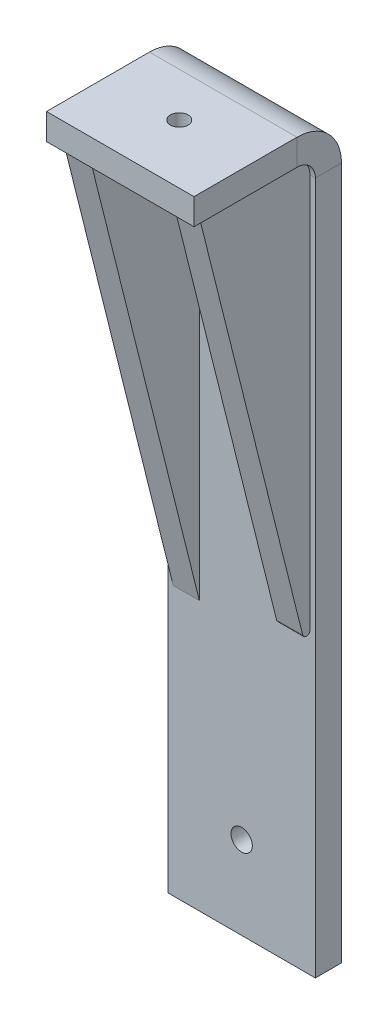
ISO-10303-21;
HEADER;
FILE_DESCRIPTION(('STEP AP214'),'2;1');
FILE_NAME('part.step','',(''),(''),'','','');
FILE_SCHEMA(('AUTOMOTIVE_DESIGN { 1 0 10303 214 1 1 1 1 }'));
ENDSEC;
DATA;
#1=APPLICATION_CONTEXT('core data for automotive mechanical design processes');
#2=APPLICATION_PROTOCOL_DEFINITION('international standard','automotive_design',2000,#1);
#3=PRODUCT_CONTEXT('',#1,'mechanical');
#4=PRODUCT('Part','Part','',(#3));
#5=PRODUCT_RELATED_PRODUCT_CATEGORY('part','',(#4));
#6=PRODUCT_DEFINITION_FORMATION('','',#4);
#7=PRODUCT_DEFINITION_CONTEXT('part definition',#1,'design');
#8=PRODUCT_DEFINITION('design','',#6,#7);
#9=PRODUCT_DEFINITION_SHAPE('','',#8);
#10=(LENGTH_UNIT() NAMED_UNIT(*) SI_UNIT(.MILLI.,.METRE.));
#11=(NAMED_UNIT(*) PLANE_ANGLE_UNIT() SI_UNIT($,.RADIAN.));
#12=(NAMED_UNIT(*) SI_UNIT($,.STERADIAN.) SOLID_ANGLE_UNIT());
#13=UNCERTAINTY_MEASURE_WITH_UNIT(LENGTH_MEASURE(1.E-05),#10,'distance_accuracy_value','');
#14=(GEOMETRIC_REPRESENTATION_CONTEXT(3) GLOBAL_UNCERTAINTY_ASSIGNED_CONTEXT((#13)) GLOBAL_UNIT_ASSIGNED_CONTEXT((#10,
#11,#12)) REPRESENTATION_CONTEXT('',''));
#15=CARTESIAN_POINT('',(0.,0.,0.));
#16=DIRECTION('',(0.,0.,1.));
#17=DIRECTION('',(1.,0.,0.));
#18=AXIS2_PLACEMENT_3D('',#15,#16,#17);
#19=CARTESIAN_POINT('',(-11.7729,122.5042,23.5458));
#20=DIRECTION('',(0.,-1.,0.));
#21=DIRECTION('',(0.,0.,-1.));
#22=AXIS2_PLACEMENT_3D('',#19,#20,#21);
#23=PLANE('',#22);
#24=DIRECTION('',(0.,0.,1.));
#25=VECTOR('',#24,1.);
#26=CARTESIAN_POINT('',(-7.2771,122.5042,23.5458));
#27=LINE('',#26,#25);
#28=CARTESIAN_POINT('',(-7.2771,122.5042,7.67079999999999));
#29=VERTEX_POINT('',#28);
#30=CARTESIAN_POINT('',(-7.2771,122.5042,23.5458));
#31=VERTEX_POINT('',#30);
#32=EDGE_CURVE('E133',#29,#31,#27,.T.);
#33=ORIENTED_EDGE('',*,*,#32,.F.);
#34=DIRECTION('',(1.,0.,0.));
#35=VECTOR('',#34,1.);
#36=CARTESIAN_POINT('',(-11.7729,122.5042,7.67079999999999));
#37=LINE('',#36,#35);
#38=CARTESIAN_POINT('',(-11.7729,122.5042,7.67079999999999));
#39=VERTEX_POINT('',#38);
#40=EDGE_CURVE('E132',#39,#29,#37,.T.);
#41=ORIENTED_EDGE('',*,*,#40,.F.);
#42=DIRECTION('',(0.,0.,1.));
#43=VECTOR('',#42,1.);
#44=CARTESIAN_POINT('',(-11.7729,122.5042,23.5458));
#45=LINE('',#44,#43);
#46=CARTESIAN_POINT('',(-11.7729,122.5042,23.5458));
#47=VERTEX_POINT('',#46);
#48=EDGE_CURVE('E127',#39,#47,#45,.T.);
#49=ORIENTED_EDGE('',*,*,#48,.T.);
#50=DIRECTION('',(1.,0.,0.));
#51=VECTOR('',#50,1.);
#52=CARTESIAN_POINT('',(-11.7729,122.5042,23.5458));
#53=LINE('',#52,#51);
#54=EDGE_CURVE('E14',#47,#31,#53,.T.);
#55=ORIENTED_EDGE('',*,*,#54,.T.);
#56=EDGE_LOOP('',(#33,#41,#49,#55));
#57=FACE_BOUND('',#56,.T.);
#58=ADVANCED_FACE('F70',(#57),#23,.F.);
#59=CARTESIAN_POINT('',(-11.7729,122.5042,23.5458));
#60=DIRECTION('',(0.,0.242535625036333,-0.970142500145332));
#61=DIRECTION('',(0.,0.970142500145332,0.242535625036333));
#62=AXIS2_PLACEMENT_3D('',#59,#60,#61);
#63=PLANE('',#62);
#64=DIRECTION('',(0.,-0.970142500145332,-0.242535625036333));
#65=VECTOR('',#64,1.);
#66=CARTESIAN_POINT('',(-7.2771,122.5042,23.5458));
#67=LINE('',#66,#65);
#68=CARTESIAN_POINT('',(-7.2771,46.3042,4.4958));
#69=VERTEX_POINT('',#68);
#70=EDGE_CURVE('E135',#31,#69,#67,.T.);
#71=ORIENTED_EDGE('',*,*,#70,.F.);
#72=ORIENTED_EDGE('',*,*,#54,.F.);
#73=DIRECTION('',(0.,-0.970142500145332,-0.242535625036333));
#74=VECTOR('',#73,1.);
#75=CARTESIAN_POINT('',(-11.7729,122.5042,23.5458));
#76=LINE('',#75,#74);
#77=CARTESIAN_POINT('',(-11.7729,46.3042,4.4958));
#78=VERTEX_POINT('',#77);
#79=EDGE_CURVE('E111',#47,#78,#76,.T.);
#80=ORIENTED_EDGE('',*,*,#79,.T.);
#81=DIRECTION('',(1.,0.,0.));
#82=VECTOR('',#81,1.);
#83=CARTESIAN_POINT('',(-11.7729,46.3042,4.4958));
#84=LINE('',#83,#82);
#85=EDGE_CURVE('E78',#78,#69,#84,.T.);
#86=ORIENTED_EDGE('',*,*,#85,.T.);
#87=EDGE_LOOP('',(#71,#72,#80,#86));
#88=FACE_BOUND('',#87,.T.);
#89=ADVANCED_FACE('F125',(#88),#63,.F.);
#90=CARTESIAN_POINT('',(-11.7729,119.3292,4.49580000000001));
#91=DIRECTION('',(0.,0.,1.));
#92=DIRECTION('',(0.,-1.,0.));
#93=AXIS2_PLACEMENT_3D('',#90,#91,#92);
#94=PLANE('',#93);
#95=DIRECTION('',(0.,1.,0.));
#96=VECTOR('',#95,1.);
#97=CARTESIAN_POINT('',(-7.2771,119.3292,4.49580000000001));
#98=LINE('',#97,#96);
#99=CARTESIAN_POINT('',(-7.2771,119.3292,4.49580000000001));
#100=VERTEX_POINT('',#99);
#101=EDGE_CURVE('E121',#69,#100,#98,.T.);
#102=ORIENTED_EDGE('',*,*,#101,.F.);
#103=ORIENTED_EDGE('',*,*,#85,.F.);
#104=DIRECTION('',(0.,1.,0.));
#105=VECTOR('',#104,1.);
#106=CARTESIAN_POINT('',(-11.7729,119.3292,4.49580000000001));
#107=LINE('',#106,#105);
#108=CARTESIAN_POINT('',(-11.7729,119.3292,4.49580000000001));
#109=VERTEX_POINT('',#108);
#110=EDGE_CURVE('E114',#78,#109,#107,.T.);
#111=ORIENTED_EDGE('',*,*,#110,.T.);
#112=DIRECTION('',(1.,0.,0.));
#113=VECTOR('',#112,1.);
#114=CARTESIAN_POINT('',(-11.7729,119.3292,4.49580000000001));
#115=LINE('',#114,#113);
#116=EDGE_CURVE('E124',#109,#100,#115,.T.);
#117=ORIENTED_EDGE('',*,*,#116,.T.);
#118=EDGE_LOOP('',(#102,#103,#111,#117));
#119=FACE_BOUND('',#118,.T.);
#120=ADVANCED_FACE('F120',(#119),#94,.F.);
#121=CARTESIAN_POINT('',(-11.7729,119.3292,7.6708));
#122=DIRECTION('',(1.,0.,0.));
#123=DIRECTION('',(0.,0.,1.));
#124=AXIS2_PLACEMENT_3D('',#121,#122,#123);
#125=CYLINDRICAL_SURFACE('',#124,3.175);
#126=CARTESIAN_POINT('',(-7.2771,119.3292,7.6708));
#127=DIRECTION('',(1.,0.,0.));
#128=DIRECTION('',(0.,0.,-1.));
#129=AXIS2_PLACEMENT_3D('',#126,#127,#128);
#130=CIRCLE('',#129,3.175);
#131=EDGE_CURVE('E100',#100,#29,#130,.T.);
#132=ORIENTED_EDGE('',*,*,#131,.F.);
#133=ORIENTED_EDGE('',*,*,#116,.F.);
#134=CARTESIAN_POINT('',(-11.7729,119.3292,7.6708));
#135=DIRECTION('',(1.,0.,0.));
#136=DIRECTION('',(0.,0.,-1.));
#137=AXIS2_PLACEMENT_3D('',#134,#135,#136);
#138=CIRCLE('',#137,3.175);
#139=EDGE_CURVE('E86',#109,#39,#138,.T.);
#140=ORIENTED_EDGE('',*,*,#139,.T.);
#141=ORIENTED_EDGE('',*,*,#40,.T.);
#142=EDGE_LOOP('',(#132,#133,#140,#141));
#143=FACE_BOUND('',#142,.T.);
#144=ADVANCED_FACE('F144',(#143),#125,.T.);
#145=CARTESIAN_POINT('',(-11.7729,119.3292,7.6708));
#146=DIRECTION('',(-1.,0.,0.));
#147=DIRECTION('',(0.,0.,-1.));
#148=AXIS2_PLACEMENT_3D('',#145,#146,#147);
#149=PLANE('',#148);
#150=ORIENTED_EDGE('',*,*,#48,.F.);
#151=ORIENTED_EDGE('',*,*,#139,.F.);
#152=ORIENTED_EDGE('',*,*,#110,.F.);
#153=ORIENTED_EDGE('',*,*,#79,.F.);
#154=EDGE_LOOP('',(#150,#151,#152,#153));
#155=FACE_BOUND('',#154,.T.);
#156=ADVANCED_FACE('F116',(#155),#149,.T.);
#157=CARTESIAN_POINT('',(-7.2771,119.3292,7.6708));
#158=DIRECTION('',(-1.,0.,0.));
#159=DIRECTION('',(0.,0.,-1.));
#160=AXIS2_PLACEMENT_3D('',#157,#158,#159);
#161=PLANE('',#160);
#162=ORIENTED_EDGE('',*,*,#32,.T.);
#163=ORIENTED_EDGE('',*,*,#70,.T.);
#164=ORIENTED_EDGE('',*,*,#101,.T.);
#165=ORIENTED_EDGE('',*,*,#131,.T.);
#166=EDGE_LOOP('',(#162,#163,#164,#165));
#167=FACE_BOUND('',#166,.T.);
#168=ADVANCED_FACE('F140',(#167),#161,.F.);
#169=CLOSED_SHELL('',(#58,#89,#120,#144,#156,#168));
#170=MANIFOLD_SOLID_BREP('B2',#169);
#171=CARTESIAN_POINT('',(11.7729,122.5042,23.5458));
#172=DIRECTION('',(0.,-1.,0.));
#173=DIRECTION('',(0.,0.,-1.));
#174=AXIS2_PLACEMENT_3D('',#171,#172,#173);
#175=PLANE('',#174);
#176=DIRECTION('',(0.,0.,1.));
#177=VECTOR('',#176,1.);
#178=CARTESIAN_POINT('',(7.2771,122.5042,23.5458));
#179=LINE('',#178,#177);
#180=CARTESIAN_POINT('',(7.2771,122.5042,7.67079999999999));
#181=VERTEX_POINT('',#180);
#182=CARTESIAN_POINT('',(7.2771,122.5042,22.7325069819332));
#183=VERTEX_POINT('',#182);
#184=EDGE_CURVE('E282',#181,#183,#179,.T.);
#185=ORIENTED_EDGE('',*,*,#184,.T.);
#186=DIRECTION('',(-1.,0.,0.));
#187=VECTOR('',#186,1.);
#188=CARTESIAN_POINT('',(11.7729,122.5042,22.7325069819332));
#189=LINE('',#188,#187);
#190=CARTESIAN_POINT('',(11.7729,122.5042,22.7325069819332));
#191=VERTEX_POINT('',#190);
#192=EDGE_CURVE('E226',#183,#191,#189,.F.);
#193=ORIENTED_EDGE('',*,*,#192,.T.);
#194=DIRECTION('',(0.,0.,1.));
#195=VECTOR('',#194,1.);
#196=CARTESIAN_POINT('',(11.7729,122.5042,23.5458));
#197=LINE('',#196,#195);
#198=CARTESIAN_POINT('',(11.7729,122.5042,7.67079999999999));
#199=VERTEX_POINT('',#198);
#200=EDGE_CURVE('E289',#199,#191,#197,.T.);
#201=ORIENTED_EDGE('',*,*,#200,.F.);
#202=DIRECTION('',(-1.,0.,0.));
#203=VECTOR('',#202,1.);
#204=CARTESIAN_POINT('',(11.7729,122.5042,7.67079999999999));
#205=LINE('',#204,#203);
#206=EDGE_CURVE('E274',#199,#181,#205,.T.);
#207=ORIENTED_EDGE('',*,*,#206,.T.);
#208=EDGE_LOOP('',(#185,#193,#201,#207));
#209=FACE_BOUND('',#208,.T.);
#210=ADVANCED_FACE('F203',(#209),#175,.F.);
#211=CARTESIAN_POINT('',(11.7729,122.5042,23.5458));
#212=DIRECTION('',(0.,0.242535625036333,-0.970142500145332));
#213=DIRECTION('',(0.,0.970142500145332,0.242535625036333));
#214=AXIS2_PLACEMENT_3D('',#211,#212,#213);
#215=PLANE('',#214);
#216=DIRECTION('',(0.,-0.970142500145332,-0.242535625036333));
#217=VECTOR('',#216,1.);
#218=CARTESIAN_POINT('',(11.7729,122.5042,23.5458));
#219=LINE('',#218,#217);
#220=CARTESIAN_POINT('',(11.7729,121.715189878102,23.3485474695255));
#221=VERTEX_POINT('',#220);
#222=CARTESIAN_POINT('',(11.7729,51.3083619503691,5.74684048759229));
#223=VERTEX_POINT('',#222);
#224=EDGE_CURVE('E264',#221,#223,#219,.T.);
#225=ORIENTED_EDGE('',*,*,#224,.F.);
#226=DIRECTION('',(-1.,0.,0.));
#227=VECTOR('',#226,1.);
#228=CARTESIAN_POINT('',(11.7729,121.715189878102,23.3485474695255));
#229=LINE('',#228,#227);
#230=CARTESIAN_POINT('',(7.2771,121.715189878102,23.3485474695255));
#231=VERTEX_POINT('',#230);
#232=EDGE_CURVE('E292',#221,#231,#229,.T.);
#233=ORIENTED_EDGE('',*,*,#232,.T.);
#234=DIRECTION('',(0.,-0.970142500145332,-0.242535625036333));
#235=VECTOR('',#234,1.);
#236=CARTESIAN_POINT('',(7.2771,122.5042,23.5458));
#237=LINE('',#236,#235);
#238=CARTESIAN_POINT('',(7.2771,51.3083619503691,5.74684048759229));
#239=VERTEX_POINT('',#238);
#240=EDGE_CURVE('E284',#231,#239,#237,.T.);
#241=ORIENTED_EDGE('',*,*,#240,.T.);
#242=DIRECTION('',(-1.,0.,0.));
#243=VECTOR('',#242,1.);
#244=CARTESIAN_POINT('',(11.7729,51.3083619503691,5.74684048759229));
#245=LINE('',#244,#243);
#246=EDGE_CURVE('E273',#239,#223,#245,.F.);
#247=ORIENTED_EDGE('',*,*,#246,.T.);
#248=EDGE_LOOP('',(#225,#233,#241,#247));
#249=FACE_BOUND('',#248,.T.);
#250=ADVANCED_FACE('F305',(#249),#215,.F.);
#251=CARTESIAN_POINT('',(11.7729,119.3292,4.49580000000001));
#252=DIRECTION('',(0.,0.,1.));
#253=DIRECTION('',(0.,-1.,0.));
#254=AXIS2_PLACEMENT_3D('',#251,#252,#253);
#255=PLANE('',#254);
#256=DIRECTION('',(0.,1.,0.));
#257=VECTOR('',#256,1.);
#258=CARTESIAN_POINT('',(11.7729,119.3292,4.49580000000001));
#259=LINE('',#258,#257);
#260=CARTESIAN_POINT('',(11.7729,51.4623720722672,4.4958));
#261=VERTEX_POINT('',#260);
#262=CARTESIAN_POINT('',(11.7729,119.3292,4.49580000000001));
#263=VERTEX_POINT('',#262);
#264=EDGE_CURVE('E256',#261,#263,#259,.T.);
#265=ORIENTED_EDGE('',*,*,#264,.F.);
#266=DIRECTION('',(-1.,0.,0.));
#267=VECTOR('',#266,1.);
#268=CARTESIAN_POINT('',(11.7729,51.4623720722672,4.4958));
#269=LINE('',#268,#267);
#270=CARTESIAN_POINT('',(7.2771,51.4623720722672,4.4958));
#271=VERTEX_POINT('',#270);
#272=EDGE_CURVE('E68',#261,#271,#269,.T.);
#273=ORIENTED_EDGE('',*,*,#272,.T.);
#274=DIRECTION('',(0.,1.,0.));
#275=VECTOR('',#274,1.);
#276=CARTESIAN_POINT('',(7.2771,119.3292,4.49580000000001));
#277=LINE('',#276,#275);
#278=CARTESIAN_POINT('',(7.2771,119.3292,4.49580000000001));
#279=VERTEX_POINT('',#278);
#280=EDGE_CURVE('E270',#271,#279,#277,.T.);
#281=ORIENTED_EDGE('',*,*,#280,.T.);
#282=DIRECTION('',(-1.,0.,0.));
#283=VECTOR('',#282,1.);
#284=CARTESIAN_POINT('',(11.7729,119.3292,4.49580000000001));
#285=LINE('',#284,#283);
#286=EDGE_CURVE('E267',#263,#279,#285,.T.);
#287=ORIENTED_EDGE('',*,*,#286,.F.);
#288=EDGE_LOOP('',(#265,#273,#281,#287));
#289=FACE_BOUND('',#288,.T.);
#290=ADVANCED_FACE('F268',(#289),#255,.F.);
#291=CARTESIAN_POINT('',(11.7729,119.3292,7.6708));
#292=DIRECTION('',(-1.,0.,0.));
#293=DIRECTION('',(0.,0.,1.));
#294=AXIS2_PLACEMENT_3D('',#291,#292,#293);
#295=CYLINDRICAL_SURFACE('',#294,3.175);
#296=CARTESIAN_POINT('',(7.2771,119.3292,7.6708));
#297=DIRECTION('',(1.,0.,0.));
#298=DIRECTION('',(0.,0.,-1.));
#299=AXIS2_PLACEMENT_3D('',#296,#297,#298);
#300=CIRCLE('',#299,3.175);
#301=EDGE_CURVE('E288',#279,#181,#300,.T.);
#302=ORIENTED_EDGE('',*,*,#301,.T.);
#303=ORIENTED_EDGE('',*,*,#206,.F.);
#304=CARTESIAN_POINT('',(11.7729,119.3292,7.6708));
#305=DIRECTION('',(1.,0.,0.));
#306=DIRECTION('',(0.,0.,-1.));
#307=AXIS2_PLACEMENT_3D('',#304,#305,#306);
#308=CIRCLE('',#307,3.175);
#309=EDGE_CURVE('E260',#263,#199,#308,.T.);
#310=ORIENTED_EDGE('',*,*,#309,.F.);
#311=ORIENTED_EDGE('',*,*,#286,.T.);
#312=EDGE_LOOP('',(#302,#303,#310,#311));
#313=FACE_BOUND('',#312,.T.);
#314=ADVANCED_FACE('F276',(#313),#295,.T.);
#315=CARTESIAN_POINT('',(11.7729,119.3292,7.6708));
#316=DIRECTION('',(1.,0.,0.));
#317=DIRECTION('',(0.,0.,-1.));
#318=AXIS2_PLACEMENT_3D('',#315,#316,#317);
#319=PLANE('',#318);
#320=ORIENTED_EDGE('',*,*,#200,.T.);
#321=CARTESIAN_POINT('',(11.7729,121.8692,22.7325069819332));
#322=DIRECTION('',(1.,0.,0.));
#323=DIRECTION('',(0.,0.,-1.));
#324=AXIS2_PLACEMENT_3D('',#321,#322,#323);
#325=CIRCLE('',#324,0.635);
#326=EDGE_CURVE('E211',#191,#221,#325,.T.);
#327=ORIENTED_EDGE('',*,*,#326,.T.);
#328=ORIENTED_EDGE('',*,*,#224,.T.);
#329=CARTESIAN_POINT('',(11.7729,51.4623720722672,5.1308));
#330=DIRECTION('',(1.,0.,0.));
#331=DIRECTION('',(0.,0.,-1.));
#332=AXIS2_PLACEMENT_3D('',#329,#330,#331);
#333=CIRCLE('',#332,0.635);
#334=EDGE_CURVE('E218',#223,#261,#333,.T.);
#335=ORIENTED_EDGE('',*,*,#334,.T.);
#336=ORIENTED_EDGE('',*,*,#264,.T.);
#337=ORIENTED_EDGE('',*,*,#309,.T.);
#338=EDGE_LOOP('',(#320,#327,#328,#335,#336,#337));
#339=FACE_BOUND('',#338,.T.);
#340=ADVANCED_FACE('F258',(#339),#319,.T.);
#341=CARTESIAN_POINT('',(7.2771,119.3292,7.6708));
#342=DIRECTION('',(1.,0.,0.));
#343=DIRECTION('',(0.,0.,-1.));
#344=AXIS2_PLACEMENT_3D('',#341,#342,#343);
#345=PLANE('',#344);
#346=ORIENTED_EDGE('',*,*,#240,.F.);
#347=CARTESIAN_POINT('',(7.2771,121.8692,22.7325069819332));
#348=DIRECTION('',(1.,0.,0.));
#349=DIRECTION('',(0.,0.,-1.));
#350=AXIS2_PLACEMENT_3D('',#347,#348,#349);
#351=CIRCLE('',#350,0.635);
#352=EDGE_CURVE('E297',#231,#183,#351,.F.);
#353=ORIENTED_EDGE('',*,*,#352,.T.);
#354=ORIENTED_EDGE('',*,*,#184,.F.);
#355=ORIENTED_EDGE('',*,*,#301,.F.);
#356=ORIENTED_EDGE('',*,*,#280,.F.);
#357=CARTESIAN_POINT('',(7.2771,51.4623720722672,5.1308));
#358=DIRECTION('',(1.,0.,0.));
#359=DIRECTION('',(0.,0.,-1.));
#360=AXIS2_PLACEMENT_3D('',#357,#358,#359);
#361=CIRCLE('',#360,0.635);
#362=EDGE_CURVE('E295',#271,#239,#361,.F.);
#363=ORIENTED_EDGE('',*,*,#362,.T.);
#364=EDGE_LOOP('',(#346,#353,#354,#355,#356,#363));
#365=FACE_BOUND('',#364,.T.);
#366=ADVANCED_FACE('F311',(#365),#345,.F.);
#367=CARTESIAN_POINT('',(11.7729,121.8692,22.7325069819332));
#368=DIRECTION('',(-1.,0.,0.));
#369=DIRECTION('',(0.,0.,1.));
#370=AXIS2_PLACEMENT_3D('',#367,#368,#369);
#371=CYLINDRICAL_SURFACE('',#370,0.635);
#372=ORIENTED_EDGE('',*,*,#326,.F.);
#373=ORIENTED_EDGE('',*,*,#192,.F.);
#374=ORIENTED_EDGE('',*,*,#352,.F.);
#375=ORIENTED_EDGE('',*,*,#232,.F.);
#376=EDGE_LOOP('',(#372,#373,#374,#375));
#377=FACE_BOUND('',#376,.T.);
#378=ADVANCED_FACE('F308',(#377),#371,.T.);
#379=CARTESIAN_POINT('',(11.7729,51.4623720722672,5.1308));
#380=DIRECTION('',(-1.,0.,0.));
#381=DIRECTION('',(0.,0.,1.));
#382=AXIS2_PLACEMENT_3D('',#379,#380,#381);
#383=CYLINDRICAL_SURFACE('',#382,0.635);
#384=ORIENTED_EDGE('',*,*,#334,.F.);
#385=ORIENTED_EDGE('',*,*,#246,.F.);
#386=ORIENTED_EDGE('',*,*,#362,.F.);
#387=ORIENTED_EDGE('',*,*,#272,.F.);
#388=EDGE_LOOP('',(#384,#385,#386,#387));
#389=FACE_BOUND('',#388,.T.);
#390=ADVANCED_FACE('F205',(#389),#383,.T.);
#391=CLOSED_SHELL('',(#210,#250,#290,#314,#340,#366,#378,#390));
#392=MANIFOLD_SOLID_BREP('B8',#391);
#393=CARTESIAN_POINT('',(-12.7,127.,4.4958));
#394=DIRECTION('',(0.,0.,-1.));
#395=DIRECTION('',(-1.,0.,0.));
#396=AXIS2_PLACEMENT_3D('',#393,#394,#395);
#397=PLANE('',#396);
#398=CARTESIAN_POINT('',(0.,14.280866767059,4.4958));
#399=DIRECTION('',(0.,0.,1.));
#400=DIRECTION('',(1.,0.,0.));
#401=AXIS2_PLACEMENT_3D('',#398,#399,#400);
#402=CIRCLE('',#401,1.8415);
#403=CARTESIAN_POINT('',(1.8415,14.280866767059,4.4958));
#404=VERTEX_POINT('',#403);
#405=EDGE_CURVE('E550',#404,#404,#402,.T.);
#406=ORIENTED_EDGE('',*,*,#405,.F.);
#407=EDGE_LOOP('',(#406));
#408=FACE_BOUND('',#407,.T.);
#409=DIRECTION('',(-1.,0.,0.));
#410=VECTOR('',#409,1.);
#411=CARTESIAN_POINT('',(-12.7,119.3292,4.49580000000001));
#412=LINE('',#411,#410);
#413=CARTESIAN_POINT('',(-12.7,119.3292,4.49580000000001));
#414=VERTEX_POINT('',#413);
#415=CARTESIAN_POINT('',(12.7,119.3292,4.49580000000001));
#416=VERTEX_POINT('',#415);
#417=EDGE_CURVE('E501',#414,#416,#412,.F.);
#418=ORIENTED_EDGE('',*,*,#417,.F.);
#419=DIRECTION('',(0.,-1.,0.));
#420=VECTOR('',#419,1.);
#421=CARTESIAN_POINT('',(-12.7,127.,4.4958));
#422=LINE('',#421,#420);
#423=CARTESIAN_POINT('',(-12.7,0.,4.4958));
#424=VERTEX_POINT('',#423);
#425=EDGE_CURVE('E392',#414,#424,#422,.T.);
#426=ORIENTED_EDGE('',*,*,#425,.T.);
#427=DIRECTION('',(1.,0.,0.));
#428=VECTOR('',#427,1.);
#429=CARTESIAN_POINT('',(-12.7,0.,4.4958));
#430=LINE('',#429,#428);
#431=CARTESIAN_POINT('',(12.7,0.,4.49579999999999));
#432=VERTEX_POINT('',#431);
#433=EDGE_CURVE('E509',#424,#432,#430,.T.);
#434=ORIENTED_EDGE('',*,*,#433,.T.);
#435=DIRECTION('',(0.,-1.,0.));
#436=VECTOR('',#435,1.);
#437=CARTESIAN_POINT('',(12.7,127.,4.49579999999999));
#438=LINE('',#437,#436);
#439=EDGE_CURVE('E201',#416,#432,#438,.T.);
#440=ORIENTED_EDGE('',*,*,#439,.F.);
#441=EDGE_LOOP('',(#418,#426,#434,#440));
#442=FACE_BOUND('',#441,.T.);
#443=ADVANCED_FACE('F378',(#408,#442),#397,.F.);
#444=CARTESIAN_POINT('',(-12.7,127.,0.));
#445=DIRECTION('',(0.,0.,-1.));
#446=DIRECTION('',(-1.,0.,0.));
#447=AXIS2_PLACEMENT_3D('',#444,#445,#446);
#448=PLANE('',#447);
#449=CARTESIAN_POINT('',(0.,14.280866767059,0.));
#450=DIRECTION('',(0.,0.,1.));
#451=DIRECTION('',(1.,0.,0.));
#452=AXIS2_PLACEMENT_3D('',#449,#450,#451);
#453=CIRCLE('',#452,1.8415);
#454=CARTESIAN_POINT('',(1.8415,14.280866767059,0.));
#455=VERTEX_POINT('',#454);
#456=EDGE_CURVE('E552',#455,#455,#453,.T.);
#457=ORIENTED_EDGE('',*,*,#456,.T.);
#458=EDGE_LOOP('',(#457));
#459=FACE_BOUND('',#458,.T.);
#460=DIRECTION('',(0.,-1.,0.));
#461=VECTOR('',#460,1.);
#462=CARTESIAN_POINT('',(-12.7,127.,0.));
#463=LINE('',#462,#461);
#464=CARTESIAN_POINT('',(-12.7,119.3292,0.));
#465=VERTEX_POINT('',#464);
#466=CARTESIAN_POINT('',(-12.7,0.,0.));
#467=VERTEX_POINT('',#466);
#468=EDGE_CURVE('E400',#465,#467,#463,.T.);
#469=ORIENTED_EDGE('',*,*,#468,.F.);
#470=DIRECTION('',(-1.,0.,0.));
#471=VECTOR('',#470,1.);
#472=CARTESIAN_POINT('',(-12.7,119.3292,0.));
#473=LINE('',#472,#471);
#474=CARTESIAN_POINT('',(12.7,119.3292,0.));
#475=VERTEX_POINT('',#474);
#476=EDGE_CURVE('E488',#465,#475,#473,.F.);
#477=ORIENTED_EDGE('',*,*,#476,.T.);
#478=DIRECTION('',(0.,-1.,0.));
#479=VECTOR('',#478,1.);
#480=CARTESIAN_POINT('',(12.7,127.,0.));
#481=LINE('',#480,#479);
#482=CARTESIAN_POINT('',(12.7,0.,0.));
#483=VERTEX_POINT('',#482);
#484=EDGE_CURVE('E385',#475,#483,#481,.T.);
#485=ORIENTED_EDGE('',*,*,#484,.T.);
#486=DIRECTION('',(1.,0.,0.));
#487=VECTOR('',#486,1.);
#488=CARTESIAN_POINT('',(-12.7,0.,0.));
#489=LINE('',#488,#487);
#490=EDGE_CURVE('E515',#467,#483,#489,.T.);
#491=ORIENTED_EDGE('',*,*,#490,.F.);
#492=EDGE_LOOP('',(#469,#477,#485,#491));
#493=FACE_BOUND('',#492,.T.);
#494=ADVANCED_FACE('F525',(#459,#493),#448,.T.);
#495=CARTESIAN_POINT('',(-12.7,127.,4.4958));
#496=DIRECTION('',(-1.,0.,0.));
#497=DIRECTION('',(0.,0.,1.));
#498=AXIS2_PLACEMENT_3D('',#495,#496,#497);
#499=PLANE('',#498);
#500=ORIENTED_EDGE('',*,*,#425,.F.);
#501=DIRECTION('',(0.,0.,-1.));
#502=VECTOR('',#501,1.);
#503=CARTESIAN_POINT('',(-12.7,119.3292,4.49580000000001));
#504=LINE('',#503,#502);
#505=EDGE_CURVE('E495',#414,#465,#504,.T.);
#506=ORIENTED_EDGE('',*,*,#505,.T.);
#507=ORIENTED_EDGE('',*,*,#468,.T.);
#508=DIRECTION('',(0.,0.,-1.));
#509=VECTOR('',#508,1.);
#510=CARTESIAN_POINT('',(-12.7,0.,4.4958));
#511=LINE('',#510,#509);
#512=EDGE_CURVE('E518',#424,#467,#511,.T.);
#513=ORIENTED_EDGE('',*,*,#512,.F.);
#514=EDGE_LOOP('',(#500,#506,#507,#513));
#515=FACE_BOUND('',#514,.T.);
#516=ADVANCED_FACE('F532',(#515),#499,.T.);
#517=CARTESIAN_POINT('',(12.7,127.,0.));
#518=DIRECTION('',(1.,0.,0.));
#519=DIRECTION('',(0.,0.,-1.));
#520=AXIS2_PLACEMENT_3D('',#517,#518,#519);
#521=PLANE('',#520);
#522=DIRECTION('',(0.,0.,-1.));
#523=VECTOR('',#522,1.);
#524=CARTESIAN_POINT('',(12.7,119.3292,4.49580000000001));
#525=LINE('',#524,#523);
#526=EDGE_CURVE('E506',#416,#475,#525,.T.);
#527=ORIENTED_EDGE('',*,*,#526,.F.);
#528=ORIENTED_EDGE('',*,*,#439,.T.);
#529=DIRECTION('',(0.,0.,1.));
#530=VECTOR('',#529,1.);
#531=CARTESIAN_POINT('',(12.7,0.,0.));
#532=LINE('',#531,#530);
#533=EDGE_CURVE('E512',#483,#432,#532,.T.);
#534=ORIENTED_EDGE('',*,*,#533,.F.);
#535=ORIENTED_EDGE('',*,*,#484,.F.);
#536=EDGE_LOOP('',(#527,#528,#534,#535));
#537=FACE_BOUND('',#536,.T.);
#538=ADVANCED_FACE('F528',(#537),#521,.T.);
#539=CARTESIAN_POINT('',(0.,0.,0.));
#540=DIRECTION('',(0.,-1.,0.));
#541=DIRECTION('',(-1.,0.,0.));
#542=AXIS2_PLACEMENT_3D('',#539,#540,#541);
#543=PLANE('',#542);
#544=ORIENTED_EDGE('',*,*,#433,.F.);
#545=ORIENTED_EDGE('',*,*,#512,.T.);
#546=ORIENTED_EDGE('',*,*,#490,.T.);
#547=ORIENTED_EDGE('',*,*,#533,.T.);
#548=EDGE_LOOP('',(#544,#545,#546,#547));
#549=FACE_BOUND('',#548,.T.);
#550=ADVANCED_FACE('F531',(#549),#543,.T.);
#551=CARTESIAN_POINT('',(12.7,119.3292,7.6708));
#552=DIRECTION('',(1.,0.,0.));
#553=DIRECTION('',(0.,0.,-1.));
#554=AXIS2_PLACEMENT_3D('',#551,#552,#553);
#555=PLANE('',#554);
#556=DIRECTION('',(0.,-1.,0.));
#557=VECTOR('',#556,1.);
#558=CARTESIAN_POINT('',(12.7,127.,7.67079999999997));
#559=LINE('',#558,#557);
#560=CARTESIAN_POINT('',(12.7,122.5042,7.67079999999999));
#561=VERTEX_POINT('',#560);
#562=CARTESIAN_POINT('',(12.7,127.,7.67079999999997));
#563=VERTEX_POINT('',#562);
#564=EDGE_CURVE('E469',#561,#563,#559,.F.);
#565=ORIENTED_EDGE('',*,*,#564,.F.);
#566=CARTESIAN_POINT('',(12.7,119.3292,7.6708));
#567=DIRECTION('',(-1.,0.,0.));
#568=DIRECTION('',(0.,0.,1.));
#569=AXIS2_PLACEMENT_3D('',#566,#567,#568);
#570=CIRCLE('',#569,3.175);
#571=EDGE_CURVE('E498',#416,#561,#570,.F.);
#572=ORIENTED_EDGE('',*,*,#571,.F.);
#573=ORIENTED_EDGE('',*,*,#526,.T.);
#574=CARTESIAN_POINT('',(12.7,119.3292,7.6708));
#575=DIRECTION('',(-1.,0.,0.));
#576=DIRECTION('',(0.,0.,1.));
#577=AXIS2_PLACEMENT_3D('',#574,#575,#576);
#578=CIRCLE('',#577,7.6708);
#579=EDGE_CURVE('E491',#475,#563,#578,.F.);
#580=ORIENTED_EDGE('',*,*,#579,.T.);
#581=EDGE_LOOP('',(#565,#572,#573,#580));
#582=FACE_BOUND('',#581,.T.);
#583=ADVANCED_FACE('F589',(#582),#555,.T.);
#584=CARTESIAN_POINT('',(-12.7,119.3292,7.6708));
#585=DIRECTION('',(1.,0.,0.));
#586=DIRECTION('',(0.,0.,-1.));
#587=AXIS2_PLACEMENT_3D('',#584,#585,#586);
#588=PLANE('',#587);
#589=CARTESIAN_POINT('',(-12.7,119.3292,7.6708));
#590=DIRECTION('',(-1.,0.,0.));
#591=DIRECTION('',(0.,0.,1.));
#592=AXIS2_PLACEMENT_3D('',#589,#590,#591);
#593=CIRCLE('',#592,3.175);
#594=CARTESIAN_POINT('',(-12.7,122.5042,7.67079999999999));
#595=VERTEX_POINT('',#594);
#596=EDGE_CURVE('E503',#595,#414,#593,.T.);
#597=ORIENTED_EDGE('',*,*,#596,.F.);
#598=DIRECTION('',(0.,-1.,0.));
#599=VECTOR('',#598,1.);
#600=CARTESIAN_POINT('',(-12.7,122.5042,7.67079999999999));
#601=LINE('',#600,#599);
#602=CARTESIAN_POINT('',(-12.7,127.,7.67079999999997));
#603=VERTEX_POINT('',#602);
#604=EDGE_CURVE('E481',#595,#603,#601,.F.);
#605=ORIENTED_EDGE('',*,*,#604,.T.);
#606=CARTESIAN_POINT('',(-12.7,119.3292,7.6708));
#607=DIRECTION('',(-1.,0.,0.));
#608=DIRECTION('',(0.,0.,1.));
#609=AXIS2_PLACEMENT_3D('',#606,#607,#608);
#610=CIRCLE('',#609,7.6708);
#611=EDGE_CURVE('E492',#603,#465,#610,.T.);
#612=ORIENTED_EDGE('',*,*,#611,.T.);
#613=ORIENTED_EDGE('',*,*,#505,.F.);
#614=EDGE_LOOP('',(#597,#605,#612,#613));
#615=FACE_BOUND('',#614,.T.);
#616=ADVANCED_FACE('F535',(#615),#588,.F.);
#617=CARTESIAN_POINT('',(-12.7,119.3292,7.6708));
#618=DIRECTION('',(-1.,0.,0.));
#619=DIRECTION('',(0.,1.,0.));
#620=AXIS2_PLACEMENT_3D('',#617,#618,#619);
#621=CYLINDRICAL_SURFACE('',#620,7.6708);
#622=ORIENTED_EDGE('',*,*,#476,.F.);
#623=ORIENTED_EDGE('',*,*,#611,.F.);
#624=DIRECTION('',(-1.,0.,0.));
#625=VECTOR('',#624,1.);
#626=CARTESIAN_POINT('',(12.7,127.,7.67079999999997));
#627=LINE('',#626,#625);
#628=EDGE_CURVE('E479',#603,#563,#627,.F.);
#629=ORIENTED_EDGE('',*,*,#628,.T.);
#630=ORIENTED_EDGE('',*,*,#579,.F.);
#631=EDGE_LOOP('',(#622,#623,#629,#630));
#632=FACE_BOUND('',#631,.T.);
#633=ADVANCED_FACE('F583',(#632),#621,.T.);
#634=CARTESIAN_POINT('',(-12.7,119.3292,7.6708));
#635=DIRECTION('',(-1.,0.,0.));
#636=DIRECTION('',(0.,1.,0.));
#637=AXIS2_PLACEMENT_3D('',#634,#635,#636);
#638=CYLINDRICAL_SURFACE('',#637,3.175);
#639=ORIENTED_EDGE('',*,*,#417,.T.);
#640=ORIENTED_EDGE('',*,*,#571,.T.);
#641=DIRECTION('',(-1.,0.,0.));
#642=VECTOR('',#641,1.);
#643=CARTESIAN_POINT('',(12.7,122.5042,7.67079999999999));
#644=LINE('',#643,#642);
#645=EDGE_CURVE('E484',#561,#595,#644,.T.);
#646=ORIENTED_EDGE('',*,*,#645,.T.);
#647=ORIENTED_EDGE('',*,*,#596,.T.);
#648=EDGE_LOOP('',(#639,#640,#646,#647));
#649=FACE_BOUND('',#648,.T.);
#650=ADVANCED_FACE('F538',(#649),#638,.F.);
#651=CARTESIAN_POINT('',(-12.7,127.,25.4));
#652=DIRECTION('',(1.,0.,0.));
#653=DIRECTION('',(0.,0.,-1.));
#654=AXIS2_PLACEMENT_3D('',#651,#652,#653);
#655=PLANE('',#654);
#656=ORIENTED_EDGE('',*,*,#604,.F.);
#657=DIRECTION('',(0.,0.,-1.));
#658=VECTOR('',#657,1.);
#659=CARTESIAN_POINT('',(-12.7,122.5042,25.4));
#660=LINE('',#659,#658);
#661=CARTESIAN_POINT('',(-12.7,122.5042,25.4));
#662=VERTEX_POINT('',#661);
#663=EDGE_CURVE('E477',#595,#662,#660,.F.);
#664=ORIENTED_EDGE('',*,*,#663,.T.);
#665=DIRECTION('',(0.,-1.,0.));
#666=VECTOR('',#665,1.);
#667=CARTESIAN_POINT('',(-12.7,127.,25.4));
#668=LINE('',#667,#666);
#669=CARTESIAN_POINT('',(-12.7,127.,25.4));
#670=VERTEX_POINT('',#669);
#671=EDGE_CURVE('E465',#670,#662,#668,.T.);
#672=ORIENTED_EDGE('',*,*,#671,.F.);
#673=DIRECTION('',(0.,0.,1.));
#674=VECTOR('',#673,1.);
#675=CARTESIAN_POINT('',(-12.7,127.,-5.19462385470797E-13));
#676=LINE('',#675,#674);
#677=EDGE_CURVE('E452',#603,#670,#676,.T.);
#678=ORIENTED_EDGE('',*,*,#677,.F.);
#679=EDGE_LOOP('',(#656,#664,#672,#678));
#680=FACE_BOUND('',#679,.T.);
#681=ADVANCED_FACE('F562',(#680),#655,.F.);
#682=CARTESIAN_POINT('',(12.7,127.,4.49579999999998));
#683=DIRECTION('',(-1.,0.,0.));
#684=DIRECTION('',(0.,0.,1.));
#685=AXIS2_PLACEMENT_3D('',#682,#683,#684);
#686=PLANE('',#685);
#687=ORIENTED_EDGE('',*,*,#564,.T.);
#688=DIRECTION('',(0.,0.,-1.));
#689=VECTOR('',#688,1.);
#690=CARTESIAN_POINT('',(12.7,127.,-5.23677995375966E-13));
#691=LINE('',#690,#689);
#692=CARTESIAN_POINT('',(12.7,127.,25.4));
#693=VERTEX_POINT('',#692);
#694=EDGE_CURVE('E450',#693,#563,#691,.T.);
#695=ORIENTED_EDGE('',*,*,#694,.F.);
#696=DIRECTION('',(0.,-1.,0.));
#697=VECTOR('',#696,1.);
#698=CARTESIAN_POINT('',(12.7,127.,25.4));
#699=LINE('',#698,#697);
#700=CARTESIAN_POINT('',(12.7,122.5042,25.4));
#701=VERTEX_POINT('',#700);
#702=EDGE_CURVE('E458',#693,#701,#699,.T.);
#703=ORIENTED_EDGE('',*,*,#702,.T.);
#704=DIRECTION('',(0.,0.,1.));
#705=VECTOR('',#704,1.);
#706=CARTESIAN_POINT('',(12.7,122.5042,4.4958));
#707=LINE('',#706,#705);
#708=EDGE_CURVE('E474',#701,#561,#707,.F.);
#709=ORIENTED_EDGE('',*,*,#708,.T.);
#710=EDGE_LOOP('',(#687,#695,#703,#709));
#711=FACE_BOUND('',#710,.T.);
#712=ADVANCED_FACE('F468',(#711),#686,.F.);
#713=CARTESIAN_POINT('',(0.,127.,-5.21570190423381E-13));
#714=DIRECTION('',(0.,-1.,0.));
#715=DIRECTION('',(0.,0.,-1.));
#716=AXIS2_PLACEMENT_3D('',#713,#714,#715);
#717=PLANE('',#716);
#718=CARTESIAN_POINT('',(0.,127.,15.24));
#719=DIRECTION('',(0.,1.,0.));
#720=DIRECTION('',(0.,0.,1.));
#721=AXIS2_PLACEMENT_3D('',#718,#719,#720);
#722=CIRCLE('',#721,1.524);
#723=CARTESIAN_POINT('',(0.,127.,16.764));
#724=VERTEX_POINT('',#723);
#725=EDGE_CURVE('E487',#724,#724,#722,.T.);
#726=ORIENTED_EDGE('',*,*,#725,.F.);
#727=EDGE_LOOP('',(#726));
#728=FACE_BOUND('',#727,.T.);
#729=ORIENTED_EDGE('',*,*,#628,.F.);
#730=ORIENTED_EDGE('',*,*,#677,.T.);
#731=DIRECTION('',(1.,0.,0.));
#732=VECTOR('',#731,1.);
#733=CARTESIAN_POINT('',(0.,127.,25.4));
#734=LINE('',#733,#732);
#735=EDGE_CURVE('E445',#670,#693,#734,.T.);
#736=ORIENTED_EDGE('',*,*,#735,.T.);
#737=ORIENTED_EDGE('',*,*,#694,.T.);
#738=EDGE_LOOP('',(#729,#730,#736,#737));
#739=FACE_BOUND('',#738,.T.);
#740=ADVANCED_FACE('F448',(#728,#739),#717,.F.);
#741=CARTESIAN_POINT('',(0.,122.5042,-5.05873188620211E-13));
#742=DIRECTION('',(0.,-1.,0.));
#743=DIRECTION('',(0.,0.,-1.));
#744=AXIS2_PLACEMENT_3D('',#741,#742,#743);
#745=PLANE('',#744);
#746=CARTESIAN_POINT('',(0.,122.5042,15.24));
#747=DIRECTION('',(0.,-1.,0.));
#748=DIRECTION('',(0.,0.,-1.));
#749=AXIS2_PLACEMENT_3D('',#746,#747,#748);
#750=CIRCLE('',#749,1.524);
#751=CARTESIAN_POINT('',(0.,122.5042,13.716));
#752=VERTEX_POINT('',#751);
#753=EDGE_CURVE('E555',#752,#752,#750,.F.);
#754=ORIENTED_EDGE('',*,*,#753,.T.);
#755=EDGE_LOOP('',(#754));
#756=FACE_BOUND('',#755,.T.);
#757=ORIENTED_EDGE('',*,*,#663,.F.);
#758=ORIENTED_EDGE('',*,*,#645,.F.);
#759=ORIENTED_EDGE('',*,*,#708,.F.);
#760=DIRECTION('',(-1.,0.,0.));
#761=VECTOR('',#760,1.);
#762=CARTESIAN_POINT('',(12.7,122.5042,25.4));
#763=LINE('',#762,#761);
#764=EDGE_CURVE('E461',#662,#701,#763,.F.);
#765=ORIENTED_EDGE('',*,*,#764,.F.);
#766=EDGE_LOOP('',(#757,#758,#759,#765));
#767=FACE_BOUND('',#766,.T.);
#768=ADVANCED_FACE('F565',(#756,#767),#745,.T.);
#769=CARTESIAN_POINT('',(12.7,127.,25.4));
#770=DIRECTION('',(0.,0.,-1.));
#771=DIRECTION('',(0.,1.,0.));
#772=AXIS2_PLACEMENT_3D('',#769,#770,#771);
#773=PLANE('',#772);
#774=ORIENTED_EDGE('',*,*,#764,.T.);
#775=ORIENTED_EDGE('',*,*,#702,.F.);
#776=ORIENTED_EDGE('',*,*,#735,.F.);
#777=ORIENTED_EDGE('',*,*,#671,.T.);
#778=EDGE_LOOP('',(#774,#775,#776,#777));
#779=FACE_BOUND('',#778,.T.);
#780=ADVANCED_FACE('F459',(#779),#773,.F.);
#781=CARTESIAN_POINT('',(0.,-0.00100000000002876,15.2400000000004));
#782=DIRECTION('',(0.,1.,0.));
#783=DIRECTION('',(0.,0.,1.));
#784=AXIS2_PLACEMENT_3D('',#781,#782,#783);
#785=CYLINDRICAL_SURFACE('',#784,1.524);
#786=ORIENTED_EDGE('',*,*,#753,.F.);
#787=EDGE_LOOP('',(#786));
#788=FACE_BOUND('',#787,.T.);
#789=ORIENTED_EDGE('',*,*,#725,.T.);
#790=EDGE_LOOP('',(#789));
#791=FACE_BOUND('',#790,.T.);
#792=ADVANCED_FACE('F573',(#788,#791),#785,.F.);
#793=CARTESIAN_POINT('',(0.,14.280866767059,0.));
#794=DIRECTION('',(0.,0.,1.));
#795=DIRECTION('',(1.,0.,0.));
#796=AXIS2_PLACEMENT_3D('',#793,#794,#795);
#797=CYLINDRICAL_SURFACE('',#796,1.8415);
#798=ORIENTED_EDGE('',*,*,#456,.F.);
#799=EDGE_LOOP('',(#798));
#800=FACE_BOUND('',#799,.T.);
#801=ORIENTED_EDGE('',*,*,#405,.T.);
#802=EDGE_LOOP('',(#801));
#803=FACE_BOUND('',#802,.T.);
#804=ADVANCED_FACE('F652',(#800,#803),#797,.F.);
#805=CLOSED_SHELL('',(#443,#494,#516,#538,#550,#583,#616,#633,#650,#681,#712,#740,#768,#780,
#792,#804));
#806=MANIFOLD_SOLID_BREP('B62',#805);
#807=ADVANCED_BREP_SHAPE_REPRESENTATION('',(#18,#170,#392,#806),#14);
#808=SHAPE_DEFINITION_REPRESENTATION(#9,#807);
ENDSEC;
END-ISO-10303-21;
